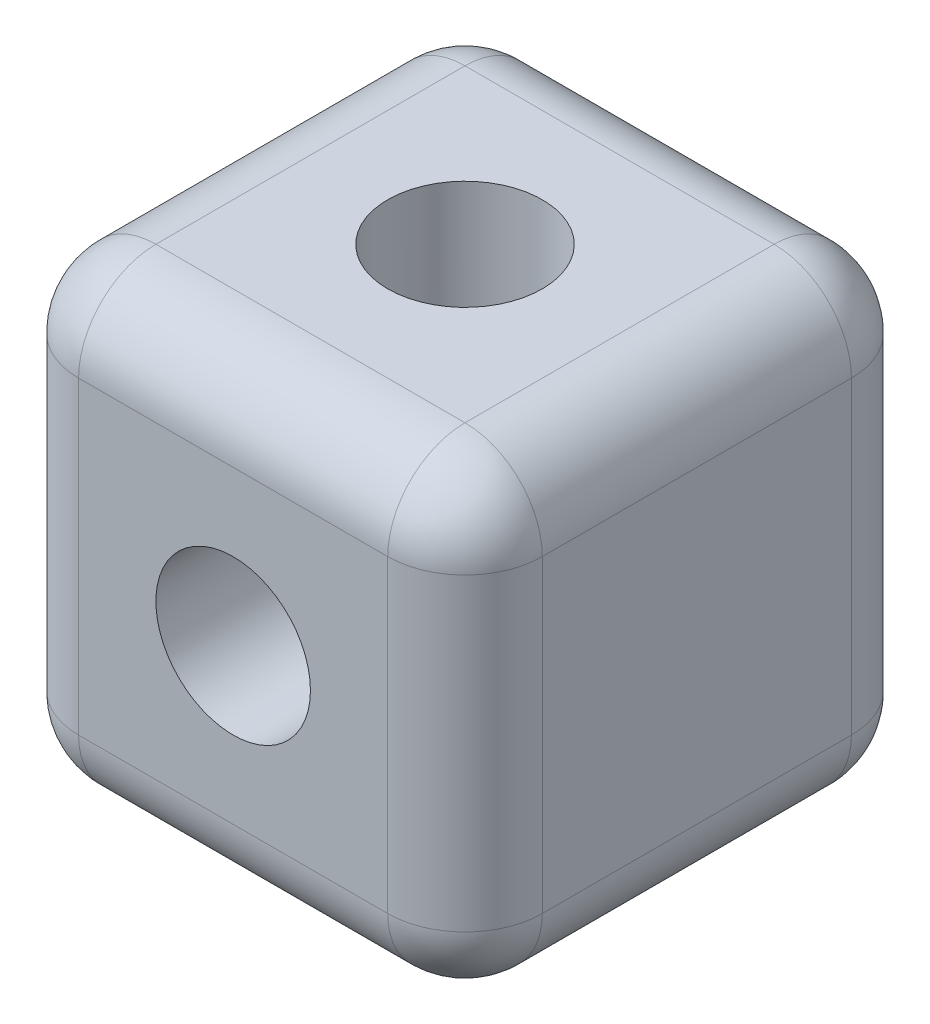
ISO-10303-21;
HEADER;
FILE_DESCRIPTION(('STEP AP214'),'2;1');
FILE_NAME('part.step','',(''),(''),'','','');
FILE_SCHEMA(('AUTOMOTIVE_DESIGN { 1 0 10303 214 1 1 1 1 }'));
ENDSEC;
DATA;
#1=APPLICATION_CONTEXT('core data for automotive mechanical design processes');
#2=APPLICATION_PROTOCOL_DEFINITION('international standard','automotive_design',2000,#1);
#3=PRODUCT_CONTEXT('',#1,'mechanical');
#4=PRODUCT('Part','Part','',(#3));
#5=PRODUCT_RELATED_PRODUCT_CATEGORY('part','',(#4));
#6=PRODUCT_DEFINITION_FORMATION('','',#4);
#7=PRODUCT_DEFINITION_CONTEXT('part definition',#1,'design');
#8=PRODUCT_DEFINITION('design','',#6,#7);
#9=PRODUCT_DEFINITION_SHAPE('','',#8);
#10=(LENGTH_UNIT() NAMED_UNIT(*) SI_UNIT(.MILLI.,.METRE.));
#11=(NAMED_UNIT(*) PLANE_ANGLE_UNIT() SI_UNIT($,.RADIAN.));
#12=(NAMED_UNIT(*) SI_UNIT($,.STERADIAN.) SOLID_ANGLE_UNIT());
#13=UNCERTAINTY_MEASURE_WITH_UNIT(LENGTH_MEASURE(1.E-05),#10,'distance_accuracy_value','');
#14=(GEOMETRIC_REPRESENTATION_CONTEXT(3) GLOBAL_UNCERTAINTY_ASSIGNED_CONTEXT((#13)) GLOBAL_UNIT_ASSIGNED_CONTEXT((#10,
#11,#12)) REPRESENTATION_CONTEXT('',''));
#15=CARTESIAN_POINT('',(0.,0.,0.));
#16=DIRECTION('',(0.,0.,1.));
#17=DIRECTION('',(1.,0.,0.));
#18=AXIS2_PLACEMENT_3D('',#15,#16,#17);
#19=CARTESIAN_POINT('',(0.,3.,-5.82842712474619));
#20=DIRECTION('',(0.,0.,1.));
#21=DIRECTION('',(1.,0.,0.));
#22=AXIS2_PLACEMENT_3D('',#19,#20,#21);
#23=CYLINDRICAL_SURFACE('',#22,1.);
#24=CARTESIAN_POINT('',(0.,3.,3.));
#25=DIRECTION('',(0.,0.,1.));
#26=DIRECTION('',(1.,0.,0.));
#27=AXIS2_PLACEMENT_3D('',#24,#25,#26);
#28=CIRCLE('',#27,1.);
#29=CARTESIAN_POINT('',(1.,3.,3.));
#30=VERTEX_POINT('',#29);
#31=EDGE_CURVE('E285',#30,#30,#28,.T.);
#32=ORIENTED_EDGE('',*,*,#31,.T.);
#33=EDGE_LOOP('',(#32));
#34=FACE_BOUND('',#33,.T.);
#35=CARTESIAN_POINT('',(0.,3.,0.));
#36=DIRECTION('',(0.,-0.707106781186547,0.707106781186547));
#37=DIRECTION('',(0.,0.707106781186547,0.707106781186547));
#38=AXIS2_PLACEMENT_3D('',#35,#36,#37);
#39=ELLIPSE('',#38,1.41421356237309,1.);
#40=CARTESIAN_POINT('',(-1.,3.,0.));
#41=VERTEX_POINT('',#40);
#42=CARTESIAN_POINT('',(1.,3.,0.));
#43=VERTEX_POINT('',#42);
#44=EDGE_CURVE('E144',#41,#43,#39,.F.);
#45=ORIENTED_EDGE('',*,*,#44,.T.);
#46=CARTESIAN_POINT('',(0.,3.,0.));
#47=DIRECTION('',(0.,0.707106781186547,0.707106781186547));
#48=DIRECTION('',(0.,-0.707106781186547,0.707106781186547));
#49=AXIS2_PLACEMENT_3D('',#46,#47,#48);
#50=ELLIPSE('',#49,1.41421356237309,1.);
#51=EDGE_CURVE('E140',#43,#41,#50,.F.);
#52=ORIENTED_EDGE('',*,*,#51,.T.);
#53=EDGE_LOOP('',(#45,#52));
#54=FACE_BOUND('',#53,.T.);
#55=ADVANCED_FACE('F41',(#34,#54),#23,.F.);
#56=CARTESIAN_POINT('',(3.,6.,3.));
#57=DIRECTION('',(-1.,0.,0.));
#58=DIRECTION('',(0.,0.,1.));
#59=AXIS2_PLACEMENT_3D('',#56,#57,#58);
#60=PLANE('',#59);
#61=DIRECTION('',(0.,-1.,0.));
#62=VECTOR('',#61,1.);
#63=CARTESIAN_POINT('',(3.,6.,2.));
#64=LINE('',#63,#62);
#65=CARTESIAN_POINT('',(3.,5.,2.));
#66=VERTEX_POINT('',#65);
#67=CARTESIAN_POINT('',(3.,1.,2.));
#68=VERTEX_POINT('',#67);
#69=EDGE_CURVE('E197',#66,#68,#64,.T.);
#70=ORIENTED_EDGE('',*,*,#69,.T.);
#71=DIRECTION('',(0.,0.,-1.));
#72=VECTOR('',#71,1.);
#73=CARTESIAN_POINT('',(3.,1.,-3.));
#74=LINE('',#73,#72);
#75=CARTESIAN_POINT('',(3.,1.,-2.));
#76=VERTEX_POINT('',#75);
#77=EDGE_CURVE('E199',#68,#76,#74,.T.);
#78=ORIENTED_EDGE('',*,*,#77,.T.);
#79=DIRECTION('',(0.,-1.,0.));
#80=VECTOR('',#79,1.);
#81=CARTESIAN_POINT('',(3.,6.,-2.));
#82=LINE('',#81,#80);
#83=CARTESIAN_POINT('',(3.,5.,-2.));
#84=VERTEX_POINT('',#83);
#85=EDGE_CURVE('E195',#76,#84,#82,.F.);
#86=ORIENTED_EDGE('',*,*,#85,.T.);
#87=DIRECTION('',(0.,0.,-1.));
#88=VECTOR('',#87,1.);
#89=CARTESIAN_POINT('',(3.,5.,3.));
#90=LINE('',#89,#88);
#91=EDGE_CURVE('E193',#84,#66,#90,.F.);
#92=ORIENTED_EDGE('',*,*,#91,.T.);
#93=EDGE_LOOP('',(#70,#78,#86,#92));
#94=FACE_BOUND('',#93,.T.);
#95=ADVANCED_FACE('F296',(#94),#60,.F.);
#96=CARTESIAN_POINT('',(-3.,6.,-3.));
#97=DIRECTION('',(0.,0.,1.));
#98=DIRECTION('',(1.,0.,0.));
#99=AXIS2_PLACEMENT_3D('',#96,#97,#98);
#100=PLANE('',#99);
#101=DIRECTION('',(0.,-1.,0.));
#102=VECTOR('',#101,1.);
#103=CARTESIAN_POINT('',(2.,6.,-3.));
#104=LINE('',#103,#102);
#105=CARTESIAN_POINT('',(2.,5.,-3.));
#106=VERTEX_POINT('',#105);
#107=CARTESIAN_POINT('',(2.,1.,-3.));
#108=VERTEX_POINT('',#107);
#109=EDGE_CURVE('E188',#106,#108,#104,.T.);
#110=ORIENTED_EDGE('',*,*,#109,.T.);
#111=DIRECTION('',(-1.,0.,0.));
#112=VECTOR('',#111,1.);
#113=CARTESIAN_POINT('',(-3.,1.,-3.));
#114=LINE('',#113,#112);
#115=CARTESIAN_POINT('',(-2.,1.,-3.));
#116=VERTEX_POINT('',#115);
#117=EDGE_CURVE('E190',#108,#116,#114,.T.);
#118=ORIENTED_EDGE('',*,*,#117,.T.);
#119=DIRECTION('',(0.,-1.,0.));
#120=VECTOR('',#119,1.);
#121=CARTESIAN_POINT('',(-2.,6.,-3.));
#122=LINE('',#121,#120);
#123=CARTESIAN_POINT('',(-2.,5.,-3.));
#124=VERTEX_POINT('',#123);
#125=EDGE_CURVE('E186',#116,#124,#122,.F.);
#126=ORIENTED_EDGE('',*,*,#125,.T.);
#127=DIRECTION('',(-1.,0.,0.));
#128=VECTOR('',#127,1.);
#129=CARTESIAN_POINT('',(-3.,5.,-3.));
#130=LINE('',#129,#128);
#131=EDGE_CURVE('E184',#124,#106,#130,.F.);
#132=ORIENTED_EDGE('',*,*,#131,.T.);
#133=EDGE_LOOP('',(#110,#118,#126,#132));
#134=FACE_BOUND('',#133,.T.);
#135=CARTESIAN_POINT('',(0.,3.,-3.));
#136=DIRECTION('',(0.,0.,1.));
#137=DIRECTION('',(1.,0.,0.));
#138=AXIS2_PLACEMENT_3D('',#135,#136,#137);
#139=CIRCLE('',#138,1.);
#140=CARTESIAN_POINT('',(1.,3.,-3.));
#141=VERTEX_POINT('',#140);
#142=EDGE_CURVE('E150',#141,#141,#139,.F.);
#143=ORIENTED_EDGE('',*,*,#142,.F.);
#144=EDGE_LOOP('',(#143));
#145=FACE_BOUND('',#144,.T.);
#146=ADVANCED_FACE('F293',(#134,#145),#100,.F.);
#147=CARTESIAN_POINT('',(-3.,6.,3.));
#148=DIRECTION('',(1.,0.,0.));
#149=DIRECTION('',(0.,0.,-1.));
#150=AXIS2_PLACEMENT_3D('',#147,#148,#149);
#151=PLANE('',#150);
#152=DIRECTION('',(0.,0.,1.));
#153=VECTOR('',#152,1.);
#154=CARTESIAN_POINT('',(-3.,1.,3.));
#155=LINE('',#154,#153);
#156=CARTESIAN_POINT('',(-3.,1.,-2.));
#157=VERTEX_POINT('',#156);
#158=CARTESIAN_POINT('',(-3.,1.,2.));
#159=VERTEX_POINT('',#158);
#160=EDGE_CURVE('E170',#157,#159,#155,.T.);
#161=ORIENTED_EDGE('',*,*,#160,.T.);
#162=DIRECTION('',(0.,-1.,0.));
#163=VECTOR('',#162,1.);
#164=CARTESIAN_POINT('',(-3.,6.,2.));
#165=LINE('',#164,#163);
#166=CARTESIAN_POINT('',(-3.,5.,2.));
#167=VERTEX_POINT('',#166);
#168=EDGE_CURVE('E172',#159,#167,#165,.F.);
#169=ORIENTED_EDGE('',*,*,#168,.T.);
#170=DIRECTION('',(0.,0.,1.));
#171=VECTOR('',#170,1.);
#172=CARTESIAN_POINT('',(-3.,5.,3.));
#173=LINE('',#172,#171);
#174=CARTESIAN_POINT('',(-3.,5.,-2.));
#175=VERTEX_POINT('',#174);
#176=EDGE_CURVE('E166',#167,#175,#173,.F.);
#177=ORIENTED_EDGE('',*,*,#176,.T.);
#178=DIRECTION('',(0.,-1.,0.));
#179=VECTOR('',#178,1.);
#180=CARTESIAN_POINT('',(-3.,6.,-2.));
#181=LINE('',#180,#179);
#182=EDGE_CURVE('E168',#175,#157,#181,.T.);
#183=ORIENTED_EDGE('',*,*,#182,.T.);
#184=EDGE_LOOP('',(#161,#169,#177,#183));
#185=FACE_BOUND('',#184,.T.);
#186=ADVANCED_FACE('F295',(#185),#151,.F.);
#187=CARTESIAN_POINT('',(-3.,6.,3.));
#188=DIRECTION('',(0.,0.,-1.));
#189=DIRECTION('',(-1.,0.,0.));
#190=AXIS2_PLACEMENT_3D('',#187,#188,#189);
#191=PLANE('',#190);
#192=DIRECTION('',(1.,0.,0.));
#193=VECTOR('',#192,1.);
#194=CARTESIAN_POINT('',(-3.,5.,3.));
#195=LINE('',#194,#193);
#196=CARTESIAN_POINT('',(2.,5.,3.));
#197=VERTEX_POINT('',#196);
#198=CARTESIAN_POINT('',(-2.,5.,3.));
#199=VERTEX_POINT('',#198);
#200=EDGE_CURVE('E152',#197,#199,#195,.F.);
#201=ORIENTED_EDGE('',*,*,#200,.T.);
#202=DIRECTION('',(0.,-1.,0.));
#203=VECTOR('',#202,1.);
#204=CARTESIAN_POINT('',(-2.,6.,3.));
#205=LINE('',#204,#203);
#206=CARTESIAN_POINT('',(-2.,1.,3.));
#207=VERTEX_POINT('',#206);
#208=EDGE_CURVE('E163',#199,#207,#205,.T.);
#209=ORIENTED_EDGE('',*,*,#208,.T.);
#210=DIRECTION('',(1.,0.,0.));
#211=VECTOR('',#210,1.);
#212=CARTESIAN_POINT('',(3.,1.,3.));
#213=LINE('',#212,#211);
#214=CARTESIAN_POINT('',(2.,1.,3.));
#215=VERTEX_POINT('',#214);
#216=EDGE_CURVE('E161',#207,#215,#213,.T.);
#217=ORIENTED_EDGE('',*,*,#216,.T.);
#218=DIRECTION('',(0.,-1.,0.));
#219=VECTOR('',#218,1.);
#220=CARTESIAN_POINT('',(2.,6.,3.));
#221=LINE('',#220,#219);
#222=EDGE_CURVE('E159',#215,#197,#221,.F.);
#223=ORIENTED_EDGE('',*,*,#222,.T.);
#224=EDGE_LOOP('',(#201,#209,#217,#223));
#225=FACE_BOUND('',#224,.T.);
#226=ORIENTED_EDGE('',*,*,#31,.F.);
#227=EDGE_LOOP('',(#226));
#228=FACE_BOUND('',#227,.T.);
#229=ADVANCED_FACE('F303',(#225,#228),#191,.F.);
#230=CARTESIAN_POINT('',(0.,6.,0.));
#231=DIRECTION('',(0.,-1.,0.));
#232=DIRECTION('',(0.,0.,-1.));
#233=AXIS2_PLACEMENT_3D('',#230,#231,#232);
#234=PLANE('',#233);
#235=DIRECTION('',(0.,0.,-1.));
#236=VECTOR('',#235,1.);
#237=CARTESIAN_POINT('',(2.,6.,0.));
#238=LINE('',#237,#236);
#239=CARTESIAN_POINT('',(2.,6.,2.));
#240=VERTEX_POINT('',#239);
#241=CARTESIAN_POINT('',(2.,6.,-2.));
#242=VERTEX_POINT('',#241);
#243=EDGE_CURVE('E202',#240,#242,#238,.T.);
#244=ORIENTED_EDGE('',*,*,#243,.T.);
#245=DIRECTION('',(-1.,0.,0.));
#246=VECTOR('',#245,1.);
#247=CARTESIAN_POINT('',(0.,6.,-2.));
#248=LINE('',#247,#246);
#249=CARTESIAN_POINT('',(-2.,6.,-2.));
#250=VERTEX_POINT('',#249);
#251=EDGE_CURVE('E11',#242,#250,#248,.T.);
#252=ORIENTED_EDGE('',*,*,#251,.T.);
#253=DIRECTION('',(0.,0.,1.));
#254=VECTOR('',#253,1.);
#255=CARTESIAN_POINT('',(-2.,6.,0.));
#256=LINE('',#255,#254);
#257=CARTESIAN_POINT('',(-2.,6.,2.));
#258=VERTEX_POINT('',#257);
#259=EDGE_CURVE('E50',#250,#258,#256,.T.);
#260=ORIENTED_EDGE('',*,*,#259,.T.);
#261=DIRECTION('',(1.,0.,0.));
#262=VECTOR('',#261,1.);
#263=CARTESIAN_POINT('',(0.,6.,2.));
#264=LINE('',#263,#262);
#265=EDGE_CURVE('E204',#258,#240,#264,.T.);
#266=ORIENTED_EDGE('',*,*,#265,.T.);
#267=EDGE_LOOP('',(#244,#252,#260,#266));
#268=FACE_BOUND('',#267,.T.);
#269=CARTESIAN_POINT('',(0.,6.,0.));
#270=DIRECTION('',(0.,1.,0.));
#271=DIRECTION('',(0.,0.,1.));
#272=AXIS2_PLACEMENT_3D('',#269,#270,#271);
#273=CIRCLE('',#272,1.);
#274=CARTESIAN_POINT('',(0.,6.,1.));
#275=VERTEX_POINT('',#274);
#276=EDGE_CURVE('E274',#275,#275,#273,.T.);
#277=ORIENTED_EDGE('',*,*,#276,.F.);
#278=EDGE_LOOP('',(#277));
#279=FACE_BOUND('',#278,.T.);
#280=ADVANCED_FACE('F321',(#268,#279),#234,.F.);
#281=CARTESIAN_POINT('',(0.,0.,0.));
#282=DIRECTION('',(0.,-1.,0.));
#283=DIRECTION('',(0.,0.,-1.));
#284=AXIS2_PLACEMENT_3D('',#281,#282,#283);
#285=PLANE('',#284);
#286=DIRECTION('',(1.,0.,0.));
#287=VECTOR('',#286,1.);
#288=CARTESIAN_POINT('',(-3.,0.,2.));
#289=LINE('',#288,#287);
#290=CARTESIAN_POINT('',(2.,0.,2.));
#291=VERTEX_POINT('',#290);
#292=CARTESIAN_POINT('',(-2.,0.,2.));
#293=VERTEX_POINT('',#292);
#294=EDGE_CURVE('E175',#291,#293,#289,.F.);
#295=ORIENTED_EDGE('',*,*,#294,.T.);
#296=DIRECTION('',(0.,0.,1.));
#297=VECTOR('',#296,1.);
#298=CARTESIAN_POINT('',(-2.,0.,-3.));
#299=LINE('',#298,#297);
#300=CARTESIAN_POINT('',(-2.,0.,-2.));
#301=VERTEX_POINT('',#300);
#302=EDGE_CURVE('E181',#293,#301,#299,.F.);
#303=ORIENTED_EDGE('',*,*,#302,.T.);
#304=DIRECTION('',(-1.,0.,0.));
#305=VECTOR('',#304,1.);
#306=CARTESIAN_POINT('',(3.,0.,-2.));
#307=LINE('',#306,#305);
#308=CARTESIAN_POINT('',(2.,0.,-2.));
#309=VERTEX_POINT('',#308);
#310=EDGE_CURVE('E179',#301,#309,#307,.F.);
#311=ORIENTED_EDGE('',*,*,#310,.T.);
#312=DIRECTION('',(0.,0.,-1.));
#313=VECTOR('',#312,1.);
#314=CARTESIAN_POINT('',(2.,0.,3.));
#315=LINE('',#314,#313);
#316=EDGE_CURVE('E177',#309,#291,#315,.F.);
#317=ORIENTED_EDGE('',*,*,#316,.T.);
#318=EDGE_LOOP('',(#295,#303,#311,#317));
#319=FACE_BOUND('',#318,.T.);
#320=CARTESIAN_POINT('',(0.,0.,0.));
#321=DIRECTION('',(0.,-1.,0.));
#322=DIRECTION('',(0.,0.,-1.));
#323=AXIS2_PLACEMENT_3D('',#320,#321,#322);
#324=CIRCLE('',#323,1.);
#325=CARTESIAN_POINT('',(0.,0.,-1.));
#326=VERTEX_POINT('',#325);
#327=EDGE_CURVE('E280',#326,#326,#324,.F.);
#328=ORIENTED_EDGE('',*,*,#327,.T.);
#329=EDGE_LOOP('',(#328));
#330=FACE_BOUND('',#329,.T.);
#331=ADVANCED_FACE('F316',(#319,#330),#285,.T.);
#332=CARTESIAN_POINT('',(0.,3.,0.));
#333=DIRECTION('',(0.,-0.707106781186547,0.707106781186547));
#334=DIRECTION('',(0.,0.707106781186547,0.707106781186547));
#335=AXIS2_PLACEMENT_3D('',#332,#333,#334);
#336=ELLIPSE('',#335,1.41421356237309,1.);
#337=EDGE_CURVE('E136',#41,#43,#336,.T.);
#338=ORIENTED_EDGE('',*,*,#337,.T.);
#339=CARTESIAN_POINT('',(0.,3.,0.));
#340=DIRECTION('',(0.,0.707106781186547,0.707106781186547));
#341=DIRECTION('',(0.,-0.707106781186547,0.707106781186547));
#342=AXIS2_PLACEMENT_3D('',#339,#340,#341);
#343=ELLIPSE('',#342,1.41421356237309,1.);
#344=EDGE_CURVE('E143',#43,#41,#343,.T.);
#345=ORIENTED_EDGE('',*,*,#344,.T.);
#346=EDGE_LOOP('',(#338,#345));
#347=FACE_BOUND('',#346,.T.);
#348=ORIENTED_EDGE('',*,*,#142,.T.);
#349=EDGE_LOOP('',(#348));
#350=FACE_BOUND('',#349,.T.);
#351=ADVANCED_FACE('F154',(#347,#350),#23,.F.);
#352=CARTESIAN_POINT('',(0.,-2.82842712474619,0.));
#353=DIRECTION('',(0.,1.,0.));
#354=DIRECTION('',(0.,0.,1.));
#355=AXIS2_PLACEMENT_3D('',#352,#353,#354);
#356=CYLINDRICAL_SURFACE('',#355,1.);
#357=ORIENTED_EDGE('',*,*,#276,.T.);
#358=EDGE_LOOP('',(#357));
#359=FACE_BOUND('',#358,.T.);
#360=ORIENTED_EDGE('',*,*,#44,.F.);
#361=ORIENTED_EDGE('',*,*,#344,.F.);
#362=EDGE_LOOP('',(#360,#361));
#363=FACE_BOUND('',#362,.T.);
#364=ADVANCED_FACE('F148',(#359,#363),#356,.F.);
#365=ORIENTED_EDGE('',*,*,#327,.F.);
#366=EDGE_LOOP('',(#365));
#367=FACE_BOUND('',#366,.T.);
#368=ORIENTED_EDGE('',*,*,#337,.F.);
#369=ORIENTED_EDGE('',*,*,#51,.F.);
#370=EDGE_LOOP('',(#368,#369));
#371=FACE_BOUND('',#370,.T.);
#372=ADVANCED_FACE('F138',(#367,#371),#356,.F.);
#373=CARTESIAN_POINT('',(2.,6.,-2.));
#374=DIRECTION('',(0.,-1.,0.));
#375=DIRECTION('',(0.,0.,-1.));
#376=AXIS2_PLACEMENT_3D('',#373,#374,#375);
#377=CYLINDRICAL_SURFACE('',#376,1.);
#378=CARTESIAN_POINT('',(2.,5.,-2.));
#379=DIRECTION('',(0.,1.,0.));
#380=DIRECTION('',(0.,0.,1.));
#381=AXIS2_PLACEMENT_3D('',#378,#379,#380);
#382=CIRCLE('',#381,1.);
#383=EDGE_CURVE('E45',#84,#106,#382,.T.);
#384=ORIENTED_EDGE('',*,*,#383,.F.);
#385=ORIENTED_EDGE('',*,*,#85,.F.);
#386=CARTESIAN_POINT('',(2.,1.,-2.));
#387=DIRECTION('',(0.,-1.,0.));
#388=DIRECTION('',(0.,0.,-1.));
#389=AXIS2_PLACEMENT_3D('',#386,#387,#388);
#390=CIRCLE('',#389,1.);
#391=EDGE_CURVE('E266',#108,#76,#390,.T.);
#392=ORIENTED_EDGE('',*,*,#391,.F.);
#393=ORIENTED_EDGE('',*,*,#109,.F.);
#394=EDGE_LOOP('',(#384,#385,#392,#393));
#395=FACE_BOUND('',#394,.T.);
#396=ADVANCED_FACE('F43',(#395),#377,.T.);
#397=CARTESIAN_POINT('',(2.,5.,-2.));
#398=DIRECTION('',(0.,0.,-1.));
#399=DIRECTION('',(-1.,0.,0.));
#400=AXIS2_PLACEMENT_3D('',#397,#398,#399);
#401=SPHERICAL_SURFACE('',#400,1.);
#402=CARTESIAN_POINT('',(2.,5.,-2.));
#403=DIRECTION('',(0.,0.,-1.));
#404=DIRECTION('',(-1.,0.,0.));
#405=AXIS2_PLACEMENT_3D('',#402,#403,#404);
#406=CIRCLE('',#405,1.);
#407=EDGE_CURVE('E261',#84,#242,#406,.F.);
#408=ORIENTED_EDGE('',*,*,#407,.F.);
#409=ORIENTED_EDGE('',*,*,#383,.T.);
#410=CARTESIAN_POINT('',(2.,5.,-2.));
#411=DIRECTION('',(1.,0.,0.));
#412=DIRECTION('',(0.,0.,-1.));
#413=AXIS2_PLACEMENT_3D('',#410,#411,#412);
#414=CIRCLE('',#413,1.);
#415=EDGE_CURVE('E264',#242,#106,#414,.F.);
#416=ORIENTED_EDGE('',*,*,#415,.F.);
#417=EDGE_LOOP('',(#408,#409,#416));
#418=FACE_BOUND('',#417,.T.);
#419=ADVANCED_FACE('F412',(#418),#401,.T.);
#420=CARTESIAN_POINT('',(2.,1.,-2.));
#421=DIRECTION('',(1.,0.,0.));
#422=DIRECTION('',(0.,0.,-1.));
#423=AXIS2_PLACEMENT_3D('',#420,#421,#422);
#424=SPHERICAL_SURFACE('',#423,1.);
#425=CARTESIAN_POINT('',(2.,1.,-2.));
#426=DIRECTION('',(1.,0.,0.));
#427=DIRECTION('',(0.,0.,-1.));
#428=AXIS2_PLACEMENT_3D('',#425,#426,#427);
#429=CIRCLE('',#428,1.);
#430=EDGE_CURVE('E256',#108,#309,#429,.F.);
#431=ORIENTED_EDGE('',*,*,#430,.F.);
#432=ORIENTED_EDGE('',*,*,#391,.T.);
#433=CARTESIAN_POINT('',(2.,1.,-2.));
#434=DIRECTION('',(0.,0.,-1.));
#435=DIRECTION('',(-1.,0.,0.));
#436=AXIS2_PLACEMENT_3D('',#433,#434,#435);
#437=CIRCLE('',#436,1.);
#438=EDGE_CURVE('E259',#309,#76,#437,.F.);
#439=ORIENTED_EDGE('',*,*,#438,.F.);
#440=EDGE_LOOP('',(#431,#432,#439));
#441=FACE_BOUND('',#440,.T.);
#442=ADVANCED_FACE('F409',(#441),#424,.T.);
#443=CARTESIAN_POINT('',(0.,5.,-2.));
#444=DIRECTION('',(-1.,0.,0.));
#445=DIRECTION('',(0.,0.,1.));
#446=AXIS2_PLACEMENT_3D('',#443,#444,#445);
#447=CYLINDRICAL_SURFACE('',#446,1.);
#448=ORIENTED_EDGE('',*,*,#415,.T.);
#449=ORIENTED_EDGE('',*,*,#131,.F.);
#450=CARTESIAN_POINT('',(-2.,5.,-2.));
#451=DIRECTION('',(-1.,0.,0.));
#452=DIRECTION('',(0.,0.,1.));
#453=AXIS2_PLACEMENT_3D('',#450,#451,#452);
#454=CIRCLE('',#453,1.);
#455=EDGE_CURVE('E250',#250,#124,#454,.T.);
#456=ORIENTED_EDGE('',*,*,#455,.F.);
#457=ORIENTED_EDGE('',*,*,#251,.F.);
#458=EDGE_LOOP('',(#448,#449,#456,#457));
#459=FACE_BOUND('',#458,.T.);
#460=ADVANCED_FACE('F406',(#459),#447,.T.);
#461=CARTESIAN_POINT('',(2.,5.,0.));
#462=DIRECTION('',(0.,0.,-1.));
#463=DIRECTION('',(-1.,0.,0.));
#464=AXIS2_PLACEMENT_3D('',#461,#462,#463);
#465=CYLINDRICAL_SURFACE('',#464,1.);
#466=ORIENTED_EDGE('',*,*,#407,.T.);
#467=ORIENTED_EDGE('',*,*,#243,.F.);
#468=CARTESIAN_POINT('',(2.,5.,2.));
#469=DIRECTION('',(0.,0.,1.));
#470=DIRECTION('',(1.,0.,0.));
#471=AXIS2_PLACEMENT_3D('',#468,#469,#470);
#472=CIRCLE('',#471,1.);
#473=EDGE_CURVE('E247',#66,#240,#472,.T.);
#474=ORIENTED_EDGE('',*,*,#473,.F.);
#475=ORIENTED_EDGE('',*,*,#91,.F.);
#476=EDGE_LOOP('',(#466,#467,#474,#475));
#477=FACE_BOUND('',#476,.T.);
#478=ADVANCED_FACE('F376',(#477),#465,.T.);
#479=CARTESIAN_POINT('',(2.,6.,2.));
#480=DIRECTION('',(0.,-1.,0.));
#481=DIRECTION('',(0.,0.,-1.));
#482=AXIS2_PLACEMENT_3D('',#479,#480,#481);
#483=CYLINDRICAL_SURFACE('',#482,1.);
#484=CARTESIAN_POINT('',(2.,1.,2.));
#485=DIRECTION('',(0.,-1.,0.));
#486=DIRECTION('',(0.,0.,-1.));
#487=AXIS2_PLACEMENT_3D('',#484,#485,#486);
#488=CIRCLE('',#487,1.);
#489=EDGE_CURVE('E241',#68,#215,#488,.T.);
#490=ORIENTED_EDGE('',*,*,#489,.F.);
#491=ORIENTED_EDGE('',*,*,#69,.F.);
#492=CARTESIAN_POINT('',(2.,5.,2.));
#493=DIRECTION('',(0.,1.,0.));
#494=DIRECTION('',(0.,0.,1.));
#495=AXIS2_PLACEMENT_3D('',#492,#493,#494);
#496=CIRCLE('',#495,1.);
#497=EDGE_CURVE('E244',#197,#66,#496,.T.);
#498=ORIENTED_EDGE('',*,*,#497,.F.);
#499=ORIENTED_EDGE('',*,*,#222,.F.);
#500=EDGE_LOOP('',(#490,#491,#498,#499));
#501=FACE_BOUND('',#500,.T.);
#502=ADVANCED_FACE('F362',(#501),#483,.T.);
#503=CARTESIAN_POINT('',(2.,1.,3.));
#504=DIRECTION('',(0.,0.,1.));
#505=DIRECTION('',(1.,0.,0.));
#506=AXIS2_PLACEMENT_3D('',#503,#504,#505);
#507=CYLINDRICAL_SURFACE('',#506,1.);
#508=ORIENTED_EDGE('',*,*,#438,.T.);
#509=ORIENTED_EDGE('',*,*,#77,.F.);
#510=CARTESIAN_POINT('',(2.,1.,2.));
#511=DIRECTION('',(0.,0.,1.));
#512=DIRECTION('',(1.,0.,0.));
#513=AXIS2_PLACEMENT_3D('',#510,#511,#512);
#514=CIRCLE('',#513,1.);
#515=EDGE_CURVE('E238',#291,#68,#514,.T.);
#516=ORIENTED_EDGE('',*,*,#515,.F.);
#517=ORIENTED_EDGE('',*,*,#316,.F.);
#518=EDGE_LOOP('',(#508,#509,#516,#517));
#519=FACE_BOUND('',#518,.T.);
#520=ADVANCED_FACE('F371',(#519),#507,.T.);
#521=CARTESIAN_POINT('',(-3.,1.,-2.));
#522=DIRECTION('',(1.,0.,0.));
#523=DIRECTION('',(0.,0.,-1.));
#524=AXIS2_PLACEMENT_3D('',#521,#522,#523);
#525=CYLINDRICAL_SURFACE('',#524,1.);
#526=ORIENTED_EDGE('',*,*,#430,.T.);
#527=ORIENTED_EDGE('',*,*,#310,.F.);
#528=CARTESIAN_POINT('',(-2.,1.,-2.));
#529=DIRECTION('',(-1.,0.,0.));
#530=DIRECTION('',(0.,0.,1.));
#531=AXIS2_PLACEMENT_3D('',#528,#529,#530);
#532=CIRCLE('',#531,1.);
#533=EDGE_CURVE('E235',#116,#301,#532,.T.);
#534=ORIENTED_EDGE('',*,*,#533,.F.);
#535=ORIENTED_EDGE('',*,*,#117,.F.);
#536=EDGE_LOOP('',(#526,#527,#534,#535));
#537=FACE_BOUND('',#536,.T.);
#538=ADVANCED_FACE('F395',(#537),#525,.T.);
#539=CARTESIAN_POINT('',(-2.,6.,-2.));
#540=DIRECTION('',(0.,-1.,0.));
#541=DIRECTION('',(0.,0.,-1.));
#542=AXIS2_PLACEMENT_3D('',#539,#540,#541);
#543=CYLINDRICAL_SURFACE('',#542,1.);
#544=CARTESIAN_POINT('',(-2.,5.,-2.));
#545=DIRECTION('',(0.,1.,0.));
#546=DIRECTION('',(0.,0.,1.));
#547=AXIS2_PLACEMENT_3D('',#544,#545,#546);
#548=CIRCLE('',#547,1.);
#549=EDGE_CURVE('E253',#124,#175,#548,.T.);
#550=ORIENTED_EDGE('',*,*,#549,.F.);
#551=ORIENTED_EDGE('',*,*,#125,.F.);
#552=CARTESIAN_POINT('',(-2.,1.,-2.));
#553=DIRECTION('',(0.,-1.,0.));
#554=DIRECTION('',(0.,0.,-1.));
#555=AXIS2_PLACEMENT_3D('',#552,#553,#554);
#556=CIRCLE('',#555,1.);
#557=EDGE_CURVE('E233',#157,#116,#556,.T.);
#558=ORIENTED_EDGE('',*,*,#557,.F.);
#559=ORIENTED_EDGE('',*,*,#182,.F.);
#560=EDGE_LOOP('',(#550,#551,#558,#559));
#561=FACE_BOUND('',#560,.T.);
#562=ADVANCED_FACE('F388',(#561),#543,.T.);
#563=CARTESIAN_POINT('',(-2.,5.,-2.));
#564=DIRECTION('',(0.,0.,-1.));
#565=DIRECTION('',(-1.,0.,0.));
#566=AXIS2_PLACEMENT_3D('',#563,#564,#565);
#567=SPHERICAL_SURFACE('',#566,1.);
#568=ORIENTED_EDGE('',*,*,#455,.T.);
#569=ORIENTED_EDGE('',*,*,#549,.T.);
#570=CARTESIAN_POINT('',(-2.,5.,-2.));
#571=DIRECTION('',(0.,0.,-1.));
#572=DIRECTION('',(-1.,0.,0.));
#573=AXIS2_PLACEMENT_3D('',#570,#571,#572);
#574=CIRCLE('',#573,1.);
#575=EDGE_CURVE('E231',#250,#175,#574,.F.);
#576=ORIENTED_EDGE('',*,*,#575,.F.);
#577=EDGE_LOOP('',(#568,#569,#576));
#578=FACE_BOUND('',#577,.T.);
#579=ADVANCED_FACE('F380',(#578),#567,.T.);
#580=CARTESIAN_POINT('',(2.,5.,2.));
#581=DIRECTION('',(1.,0.,0.));
#582=DIRECTION('',(0.,0.,-1.));
#583=AXIS2_PLACEMENT_3D('',#580,#581,#582);
#584=SPHERICAL_SURFACE('',#583,1.);
#585=ORIENTED_EDGE('',*,*,#497,.T.);
#586=ORIENTED_EDGE('',*,*,#473,.T.);
#587=CARTESIAN_POINT('',(2.,5.,2.));
#588=DIRECTION('',(1.,0.,0.));
#589=DIRECTION('',(0.,0.,-1.));
#590=AXIS2_PLACEMENT_3D('',#587,#588,#589);
#591=CIRCLE('',#590,1.);
#592=EDGE_CURVE('E228',#197,#240,#591,.F.);
#593=ORIENTED_EDGE('',*,*,#592,.F.);
#594=EDGE_LOOP('',(#585,#586,#593));
#595=FACE_BOUND('',#594,.T.);
#596=ADVANCED_FACE('F378',(#595),#584,.T.);
#597=CARTESIAN_POINT('',(2.,1.,2.));
#598=DIRECTION('',(1.,0.,0.));
#599=DIRECTION('',(0.,0.,-1.));
#600=AXIS2_PLACEMENT_3D('',#597,#598,#599);
#601=SPHERICAL_SURFACE('',#600,1.);
#602=ORIENTED_EDGE('',*,*,#515,.T.);
#603=ORIENTED_EDGE('',*,*,#489,.T.);
#604=CARTESIAN_POINT('',(2.,1.,2.));
#605=DIRECTION('',(1.,0.,0.));
#606=DIRECTION('',(0.,0.,-1.));
#607=AXIS2_PLACEMENT_3D('',#604,#605,#606);
#608=CIRCLE('',#607,1.);
#609=EDGE_CURVE('E225',#291,#215,#608,.F.);
#610=ORIENTED_EDGE('',*,*,#609,.F.);
#611=EDGE_LOOP('',(#602,#603,#610));
#612=FACE_BOUND('',#611,.T.);
#613=ADVANCED_FACE('F366',(#612),#601,.T.);
#614=CARTESIAN_POINT('',(-2.,1.,-2.));
#615=DIRECTION('',(0.,0.,-1.));
#616=DIRECTION('',(-1.,0.,0.));
#617=AXIS2_PLACEMENT_3D('',#614,#615,#616);
#618=SPHERICAL_SURFACE('',#617,1.);
#619=ORIENTED_EDGE('',*,*,#557,.T.);
#620=ORIENTED_EDGE('',*,*,#533,.T.);
#621=CARTESIAN_POINT('',(-2.,1.,-2.));
#622=DIRECTION('',(0.,0.,-1.));
#623=DIRECTION('',(-1.,0.,0.));
#624=AXIS2_PLACEMENT_3D('',#621,#622,#623);
#625=CIRCLE('',#624,1.);
#626=EDGE_CURVE('E223',#157,#301,#625,.F.);
#627=ORIENTED_EDGE('',*,*,#626,.F.);
#628=EDGE_LOOP('',(#619,#620,#627));
#629=FACE_BOUND('',#628,.T.);
#630=ADVANCED_FACE('F386',(#629),#618,.T.);
#631=CARTESIAN_POINT('',(-2.,5.,0.));
#632=DIRECTION('',(0.,0.,1.));
#633=DIRECTION('',(1.,0.,0.));
#634=AXIS2_PLACEMENT_3D('',#631,#632,#633);
#635=CYLINDRICAL_SURFACE('',#634,1.);
#636=ORIENTED_EDGE('',*,*,#575,.T.);
#637=ORIENTED_EDGE('',*,*,#176,.F.);
#638=CARTESIAN_POINT('',(-2.,5.,2.));
#639=DIRECTION('',(0.,0.,1.));
#640=DIRECTION('',(1.,0.,0.));
#641=AXIS2_PLACEMENT_3D('',#638,#639,#640);
#642=CIRCLE('',#641,1.);
#643=EDGE_CURVE('E220',#258,#167,#642,.T.);
#644=ORIENTED_EDGE('',*,*,#643,.F.);
#645=ORIENTED_EDGE('',*,*,#259,.F.);
#646=EDGE_LOOP('',(#636,#637,#644,#645));
#647=FACE_BOUND('',#646,.T.);
#648=ADVANCED_FACE('F422',(#647),#635,.T.);
#649=CARTESIAN_POINT('',(0.,5.,2.));
#650=DIRECTION('',(1.,0.,0.));
#651=DIRECTION('',(0.,0.,-1.));
#652=AXIS2_PLACEMENT_3D('',#649,#650,#651);
#653=CYLINDRICAL_SURFACE('',#652,1.);
#654=ORIENTED_EDGE('',*,*,#592,.T.);
#655=ORIENTED_EDGE('',*,*,#265,.F.);
#656=CARTESIAN_POINT('',(-2.,5.,2.));
#657=DIRECTION('',(-1.,0.,0.));
#658=DIRECTION('',(0.,0.,1.));
#659=AXIS2_PLACEMENT_3D('',#656,#657,#658);
#660=CIRCLE('',#659,1.);
#661=EDGE_CURVE('E217',#199,#258,#660,.T.);
#662=ORIENTED_EDGE('',*,*,#661,.F.);
#663=ORIENTED_EDGE('',*,*,#200,.F.);
#664=EDGE_LOOP('',(#654,#655,#662,#663));
#665=FACE_BOUND('',#664,.T.);
#666=ADVANCED_FACE('F343',(#665),#653,.T.);
#667=CARTESIAN_POINT('',(-3.,1.,2.));
#668=DIRECTION('',(-1.,0.,0.));
#669=DIRECTION('',(0.,0.,1.));
#670=AXIS2_PLACEMENT_3D('',#667,#668,#669);
#671=CYLINDRICAL_SURFACE('',#670,1.);
#672=ORIENTED_EDGE('',*,*,#609,.T.);
#673=ORIENTED_EDGE('',*,*,#216,.F.);
#674=CARTESIAN_POINT('',(-2.,1.,2.));
#675=DIRECTION('',(-1.,0.,0.));
#676=DIRECTION('',(0.,0.,1.));
#677=AXIS2_PLACEMENT_3D('',#674,#675,#676);
#678=CIRCLE('',#677,1.);
#679=EDGE_CURVE('E214',#293,#207,#678,.T.);
#680=ORIENTED_EDGE('',*,*,#679,.F.);
#681=ORIENTED_EDGE('',*,*,#294,.F.);
#682=EDGE_LOOP('',(#672,#673,#680,#681));
#683=FACE_BOUND('',#682,.T.);
#684=ADVANCED_FACE('F358',(#683),#671,.T.);
#685=CARTESIAN_POINT('',(-2.,1.,3.));
#686=DIRECTION('',(0.,0.,-1.));
#687=DIRECTION('',(-1.,0.,0.));
#688=AXIS2_PLACEMENT_3D('',#685,#686,#687);
#689=CYLINDRICAL_SURFACE('',#688,1.);
#690=ORIENTED_EDGE('',*,*,#626,.T.);
#691=ORIENTED_EDGE('',*,*,#302,.F.);
#692=CARTESIAN_POINT('',(-2.,1.,2.));
#693=DIRECTION('',(0.,0.,1.));
#694=DIRECTION('',(1.,0.,0.));
#695=AXIS2_PLACEMENT_3D('',#692,#693,#694);
#696=CIRCLE('',#695,1.);
#697=EDGE_CURVE('E211',#159,#293,#696,.T.);
#698=ORIENTED_EDGE('',*,*,#697,.F.);
#699=ORIENTED_EDGE('',*,*,#160,.F.);
#700=EDGE_LOOP('',(#690,#691,#698,#699));
#701=FACE_BOUND('',#700,.T.);
#702=ADVANCED_FACE('F428',(#701),#689,.T.);
#703=CARTESIAN_POINT('',(-2.,5.,2.));
#704=DIRECTION('',(0.,1.,0.));
#705=DIRECTION('',(0.,0.,1.));
#706=AXIS2_PLACEMENT_3D('',#703,#704,#705);
#707=SPHERICAL_SURFACE('',#706,1.);
#708=ORIENTED_EDGE('',*,*,#661,.T.);
#709=ORIENTED_EDGE('',*,*,#643,.T.);
#710=CARTESIAN_POINT('',(-2.,5.,2.));
#711=DIRECTION('',(0.,1.,0.));
#712=DIRECTION('',(0.,0.,1.));
#713=AXIS2_PLACEMENT_3D('',#710,#711,#712);
#714=CIRCLE('',#713,1.);
#715=EDGE_CURVE('E209',#199,#167,#714,.F.);
#716=ORIENTED_EDGE('',*,*,#715,.F.);
#717=EDGE_LOOP('',(#708,#709,#716));
#718=FACE_BOUND('',#717,.T.);
#719=ADVANCED_FACE('F345',(#718),#707,.T.);
#720=CARTESIAN_POINT('',(-2.,1.,2.));
#721=DIRECTION('',(0.,-1.,0.));
#722=DIRECTION('',(0.,0.,-1.));
#723=AXIS2_PLACEMENT_3D('',#720,#721,#722);
#724=SPHERICAL_SURFACE('',#723,1.);
#725=ORIENTED_EDGE('',*,*,#697,.T.);
#726=ORIENTED_EDGE('',*,*,#679,.T.);
#727=CARTESIAN_POINT('',(-2.,1.,2.));
#728=DIRECTION('',(0.,-1.,0.));
#729=DIRECTION('',(0.,0.,-1.));
#730=AXIS2_PLACEMENT_3D('',#727,#728,#729);
#731=CIRCLE('',#730,1.);
#732=EDGE_CURVE('E207',#159,#207,#731,.F.);
#733=ORIENTED_EDGE('',*,*,#732,.F.);
#734=EDGE_LOOP('',(#725,#726,#733));
#735=FACE_BOUND('',#734,.T.);
#736=ADVANCED_FACE('F354',(#735),#724,.T.);
#737=CARTESIAN_POINT('',(-2.,6.,2.));
#738=DIRECTION('',(0.,-1.,0.));
#739=DIRECTION('',(0.,0.,-1.));
#740=AXIS2_PLACEMENT_3D('',#737,#738,#739);
#741=CYLINDRICAL_SURFACE('',#740,1.);
#742=ORIENTED_EDGE('',*,*,#715,.T.);
#743=ORIENTED_EDGE('',*,*,#168,.F.);
#744=ORIENTED_EDGE('',*,*,#732,.T.);
#745=ORIENTED_EDGE('',*,*,#208,.F.);
#746=EDGE_LOOP('',(#742,#743,#744,#745));
#747=FACE_BOUND('',#746,.T.);
#748=ADVANCED_FACE('F349',(#747),#741,.T.);
#749=CLOSED_SHELL('',(#55,#95,#146,#186,#229,#280,#331,#351,#364,#372,#396,#419,#442,#460,#478,
#502,#520,#538,#562,#579,#596,#613,#630,#648,#666,#684,#702,#719,#736,#748));
#750=MANIFOLD_SOLID_BREP('B2',#749);
#751=ADVANCED_BREP_SHAPE_REPRESENTATION('',(#18,#750),#14);
#752=SHAPE_DEFINITION_REPRESENTATION(#9,#751);
ENDSEC;
END-ISO-10303-21;
